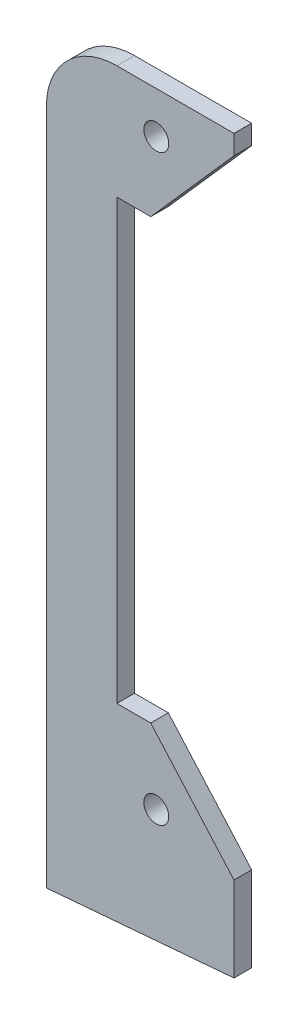
ISO-10303-21;
HEADER;
FILE_DESCRIPTION(('STEP AP214'),'2;1');
FILE_NAME('part.step','',(''),(''),'','','');
FILE_SCHEMA(('AUTOMOTIVE_DESIGN { 1 0 10303 214 1 1 1 1 }'));
ENDSEC;
DATA;
#1=APPLICATION_CONTEXT('core data for automotive mechanical design processes');
#2=APPLICATION_PROTOCOL_DEFINITION('international standard','automotive_design',2000,#1);
#3=PRODUCT_CONTEXT('',#1,'mechanical');
#4=PRODUCT('Part','Part','',(#3));
#5=PRODUCT_RELATED_PRODUCT_CATEGORY('part','',(#4));
#6=PRODUCT_DEFINITION_FORMATION('','',#4);
#7=PRODUCT_DEFINITION_CONTEXT('part definition',#1,'design');
#8=PRODUCT_DEFINITION('design','',#6,#7);
#9=PRODUCT_DEFINITION_SHAPE('','',#8);
#10=(LENGTH_UNIT() NAMED_UNIT(*) SI_UNIT(.MILLI.,.METRE.));
#11=(NAMED_UNIT(*) PLANE_ANGLE_UNIT() SI_UNIT($,.RADIAN.));
#12=(NAMED_UNIT(*) SI_UNIT($,.STERADIAN.) SOLID_ANGLE_UNIT());
#13=UNCERTAINTY_MEASURE_WITH_UNIT(LENGTH_MEASURE(1.E-05),#10,'distance_accuracy_value','');
#14=(GEOMETRIC_REPRESENTATION_CONTEXT(3) GLOBAL_UNCERTAINTY_ASSIGNED_CONTEXT((#13)) GLOBAL_UNIT_ASSIGNED_CONTEXT((#10,
#11,#12)) REPRESENTATION_CONTEXT('',''));
#15=CARTESIAN_POINT('',(0.,0.,0.));
#16=DIRECTION('',(0.,0.,1.));
#17=DIRECTION('',(1.,0.,0.));
#18=AXIS2_PLACEMENT_3D('',#15,#16,#17);
#19=CARTESIAN_POINT('',(-223.5,3.5,3.175));
#20=DIRECTION('',(-1.,0.,0.));
#21=DIRECTION('',(0.,0.,1.));
#22=AXIS2_PLACEMENT_3D('',#19,#20,#21);
#23=PLANE('',#22);
#24=DIRECTION('',(0.,1.,0.));
#25=VECTOR('',#24,1.);
#26=CARTESIAN_POINT('',(-223.5,3.5,3.175));
#27=LINE('',#26,#25);
#28=CARTESIAN_POINT('',(-223.5,-11.7915,3.175));
#29=VERTEX_POINT('',#28);
#30=CARTESIAN_POINT('',(-223.5,3.5,3.175));
#31=VERTEX_POINT('',#30);
#32=EDGE_CURVE('E129',#29,#31,#27,.T.);
#33=ORIENTED_EDGE('',*,*,#32,.F.);
#34=DIRECTION('',(0.,0.,1.));
#35=VECTOR('',#34,1.);
#36=CARTESIAN_POINT('',(-223.5,-11.7915,-1.905));
#37=LINE('',#36,#35);
#38=CARTESIAN_POINT('',(-223.5,-11.7915,0.));
#39=VERTEX_POINT('',#38);
#40=EDGE_CURVE('E118',#39,#29,#37,.T.);
#41=ORIENTED_EDGE('',*,*,#40,.F.);
#42=DIRECTION('',(0.,1.,0.));
#43=VECTOR('',#42,1.);
#44=CARTESIAN_POINT('',(-223.5,3.5,0.));
#45=LINE('',#44,#43);
#46=CARTESIAN_POINT('',(-223.5,3.5,0.));
#47=VERTEX_POINT('',#46);
#48=EDGE_CURVE('E162',#39,#47,#45,.T.);
#49=ORIENTED_EDGE('',*,*,#48,.T.);
#50=DIRECTION('',(0.,0.,-1.));
#51=VECTOR('',#50,1.);
#52=CARTESIAN_POINT('',(-223.5,3.5,3.175));
#53=LINE('',#52,#51);
#54=EDGE_CURVE('E135',#31,#47,#53,.T.);
#55=ORIENTED_EDGE('',*,*,#54,.F.);
#56=EDGE_LOOP('',(#33,#41,#49,#55));
#57=FACE_BOUND('',#56,.T.);
#58=ADVANCED_FACE('F36',(#57),#23,.F.);
#59=CARTESIAN_POINT('',(-223.5,3.5,3.175));
#60=DIRECTION('',(-0.749837855365093,-0.661621637086846,0.));
#61=DIRECTION('',(0.661621637086846,-0.749837855365093,0.));
#62=AXIS2_PLACEMENT_3D('',#59,#60,#61);
#63=PLANE('',#62);
#64=DIRECTION('',(-0.661621637086846,0.749837855365093,0.));
#65=VECTOR('',#64,1.);
#66=CARTESIAN_POINT('',(-223.5,3.5,0.));
#67=LINE('',#66,#65);
#68=CARTESIAN_POINT('',(-238.5,20.5,0.));
#69=VERTEX_POINT('',#68);
#70=EDGE_CURVE('E164',#47,#69,#67,.T.);
#71=ORIENTED_EDGE('',*,*,#70,.T.);
#72=DIRECTION('',(0.,0.,-1.));
#73=VECTOR('',#72,1.);
#74=CARTESIAN_POINT('',(-238.5,20.5,3.175));
#75=LINE('',#74,#73);
#76=CARTESIAN_POINT('',(-238.5,20.5,3.175));
#77=VERTEX_POINT('',#76);
#78=EDGE_CURVE('E192',#77,#69,#75,.T.);
#79=ORIENTED_EDGE('',*,*,#78,.F.);
#80=DIRECTION('',(-0.661621637086846,0.749837855365093,0.));
#81=VECTOR('',#80,1.);
#82=CARTESIAN_POINT('',(-223.5,3.5,3.175));
#83=LINE('',#82,#81);
#84=EDGE_CURVE('E137',#31,#77,#83,.T.);
#85=ORIENTED_EDGE('',*,*,#84,.F.);
#86=ORIENTED_EDGE('',*,*,#54,.T.);
#87=EDGE_LOOP('',(#71,#79,#85,#86));
#88=FACE_BOUND('',#87,.T.);
#89=ADVANCED_FACE('F239',(#88),#63,.F.);
#90=CARTESIAN_POINT('',(-238.5,20.5,3.175));
#91=DIRECTION('',(0.,-1.,0.));
#92=DIRECTION('',(0.,0.,-1.));
#93=AXIS2_PLACEMENT_3D('',#90,#91,#92);
#94=PLANE('',#93);
#95=DIRECTION('',(-1.,0.,0.));
#96=VECTOR('',#95,1.);
#97=CARTESIAN_POINT('',(-238.5,20.5,0.));
#98=LINE('',#97,#96);
#99=CARTESIAN_POINT('',(-244.6,20.5,0.));
#100=VERTEX_POINT('',#99);
#101=EDGE_CURVE('E166',#69,#100,#98,.T.);
#102=ORIENTED_EDGE('',*,*,#101,.T.);
#103=DIRECTION('',(0.,0.,-1.));
#104=VECTOR('',#103,1.);
#105=CARTESIAN_POINT('',(-244.6,20.5,3.175));
#106=LINE('',#105,#104);
#107=CARTESIAN_POINT('',(-244.6,20.5,3.175));
#108=VERTEX_POINT('',#107);
#109=EDGE_CURVE('E189',#108,#100,#106,.T.);
#110=ORIENTED_EDGE('',*,*,#109,.F.);
#111=DIRECTION('',(-1.,0.,0.));
#112=VECTOR('',#111,1.);
#113=CARTESIAN_POINT('',(-238.5,20.5,3.175));
#114=LINE('',#113,#112);
#115=EDGE_CURVE('E140',#77,#108,#114,.T.);
#116=ORIENTED_EDGE('',*,*,#115,.F.);
#117=ORIENTED_EDGE('',*,*,#78,.T.);
#118=EDGE_LOOP('',(#102,#110,#116,#117));
#119=FACE_BOUND('',#118,.T.);
#120=ADVANCED_FACE('F236',(#119),#94,.F.);
#121=CARTESIAN_POINT('',(-244.6,20.5,3.175));
#122=DIRECTION('',(-1.,0.,0.));
#123=DIRECTION('',(0.,0.,1.));
#124=AXIS2_PLACEMENT_3D('',#121,#122,#123);
#125=PLANE('',#124);
#126=DIRECTION('',(0.,1.,0.));
#127=VECTOR('',#126,1.);
#128=CARTESIAN_POINT('',(-244.6,20.5,0.));
#129=LINE('',#128,#127);
#130=CARTESIAN_POINT('',(-244.6,99.5,0.));
#131=VERTEX_POINT('',#130);
#132=EDGE_CURVE('E168',#100,#131,#129,.T.);
#133=ORIENTED_EDGE('',*,*,#132,.T.);
#134=DIRECTION('',(0.,0.,-1.));
#135=VECTOR('',#134,1.);
#136=CARTESIAN_POINT('',(-244.6,99.5,3.175));
#137=LINE('',#136,#135);
#138=CARTESIAN_POINT('',(-244.6,99.5,3.175));
#139=VERTEX_POINT('',#138);
#140=EDGE_CURVE('E186',#139,#131,#137,.T.);
#141=ORIENTED_EDGE('',*,*,#140,.F.);
#142=DIRECTION('',(0.,1.,0.));
#143=VECTOR('',#142,1.);
#144=CARTESIAN_POINT('',(-244.6,20.5,3.175));
#145=LINE('',#144,#143);
#146=EDGE_CURVE('E150',#108,#139,#145,.T.);
#147=ORIENTED_EDGE('',*,*,#146,.F.);
#148=ORIENTED_EDGE('',*,*,#109,.T.);
#149=EDGE_LOOP('',(#133,#141,#147,#148));
#150=FACE_BOUND('',#149,.T.);
#151=ADVANCED_FACE('F231',(#150),#125,.F.);
#152=CARTESIAN_POINT('',(-244.6,99.5,3.175));
#153=DIRECTION('',(0.,1.,0.));
#154=DIRECTION('',(0.,0.,1.));
#155=AXIS2_PLACEMENT_3D('',#152,#153,#154);
#156=PLANE('',#155);
#157=DIRECTION('',(1.,0.,0.));
#158=VECTOR('',#157,1.);
#159=CARTESIAN_POINT('',(-244.6,99.5,0.));
#160=LINE('',#159,#158);
#161=CARTESIAN_POINT('',(-238.5,99.5,0.));
#162=VERTEX_POINT('',#161);
#163=EDGE_CURVE('E170',#131,#162,#160,.T.);
#164=ORIENTED_EDGE('',*,*,#163,.T.);
#165=DIRECTION('',(0.,0.,-1.));
#166=VECTOR('',#165,1.);
#167=CARTESIAN_POINT('',(-238.5,99.5,3.175));
#168=LINE('',#167,#166);
#169=CARTESIAN_POINT('',(-238.5,99.5,3.175));
#170=VERTEX_POINT('',#169);
#171=EDGE_CURVE('E183',#170,#162,#168,.T.);
#172=ORIENTED_EDGE('',*,*,#171,.F.);
#173=DIRECTION('',(1.,0.,0.));
#174=VECTOR('',#173,1.);
#175=CARTESIAN_POINT('',(-244.6,99.5,3.175));
#176=LINE('',#175,#174);
#177=EDGE_CURVE('E152',#139,#170,#176,.T.);
#178=ORIENTED_EDGE('',*,*,#177,.F.);
#179=ORIENTED_EDGE('',*,*,#140,.T.);
#180=EDGE_LOOP('',(#164,#172,#178,#179));
#181=FACE_BOUND('',#180,.T.);
#182=ADVANCED_FACE('F225',(#181),#156,.F.);
#183=CARTESIAN_POINT('',(-238.5,99.5,3.175));
#184=DIRECTION('',(-0.749837855365093,0.661621637086846,0.));
#185=DIRECTION('',(-0.661621637086846,-0.749837855365093,0.));
#186=AXIS2_PLACEMENT_3D('',#183,#184,#185);
#187=PLANE('',#186);
#188=DIRECTION('',(0.661621637086846,0.749837855365093,0.));
#189=VECTOR('',#188,1.);
#190=CARTESIAN_POINT('',(-238.5,99.5,0.));
#191=LINE('',#190,#189);
#192=CARTESIAN_POINT('',(-223.5,116.5,0.));
#193=VERTEX_POINT('',#192);
#194=EDGE_CURVE('E172',#162,#193,#191,.T.);
#195=ORIENTED_EDGE('',*,*,#194,.T.);
#196=DIRECTION('',(0.,0.,-1.));
#197=VECTOR('',#196,1.);
#198=CARTESIAN_POINT('',(-223.5,116.5,3.175));
#199=LINE('',#198,#197);
#200=CARTESIAN_POINT('',(-223.5,116.5,3.175));
#201=VERTEX_POINT('',#200);
#202=EDGE_CURVE('E180',#201,#193,#199,.T.);
#203=ORIENTED_EDGE('',*,*,#202,.F.);
#204=DIRECTION('',(0.661621637086846,0.749837855365093,0.));
#205=VECTOR('',#204,1.);
#206=CARTESIAN_POINT('',(-238.5,99.5,3.175));
#207=LINE('',#206,#205);
#208=EDGE_CURVE('E154',#170,#201,#207,.T.);
#209=ORIENTED_EDGE('',*,*,#208,.F.);
#210=ORIENTED_EDGE('',*,*,#171,.T.);
#211=EDGE_LOOP('',(#195,#203,#209,#210));
#212=FACE_BOUND('',#211,.T.);
#213=ADVANCED_FACE('F220',(#212),#187,.F.);
#214=CARTESIAN_POINT('',(-223.5,118.,3.175));
#215=DIRECTION('',(-1.,0.,0.));
#216=DIRECTION('',(0.,0.,1.));
#217=AXIS2_PLACEMENT_3D('',#214,#215,#216);
#218=PLANE('',#217);
#219=DIRECTION('',(0.,1.,0.));
#220=VECTOR('',#219,1.);
#221=CARTESIAN_POINT('',(-223.5,118.,0.));
#222=LINE('',#221,#220);
#223=CARTESIAN_POINT('',(-223.5,120.,0.));
#224=VERTEX_POINT('',#223);
#225=EDGE_CURVE('E175',#193,#224,#222,.T.);
#226=ORIENTED_EDGE('',*,*,#225,.T.);
#227=DIRECTION('',(0.,0.,-1.));
#228=VECTOR('',#227,1.);
#229=CARTESIAN_POINT('',(-223.5,120.,3.175));
#230=LINE('',#229,#228);
#231=CARTESIAN_POINT('',(-223.5,120.,3.175));
#232=VERTEX_POINT('',#231);
#233=EDGE_CURVE('E161',#232,#224,#230,.T.);
#234=ORIENTED_EDGE('',*,*,#233,.F.);
#235=DIRECTION('',(0.,1.,0.));
#236=VECTOR('',#235,1.);
#237=CARTESIAN_POINT('',(-223.5,116.5,3.175));
#238=LINE('',#237,#236);
#239=EDGE_CURVE('E156',#201,#232,#238,.T.);
#240=ORIENTED_EDGE('',*,*,#239,.F.);
#241=ORIENTED_EDGE('',*,*,#202,.T.);
#242=EDGE_LOOP('',(#226,#234,#240,#241));
#243=FACE_BOUND('',#242,.T.);
#244=ADVANCED_FACE('F215',(#243),#218,.F.);
#245=CARTESIAN_POINT('',(-223.5,120.,3.175));
#246=DIRECTION('',(0.,-1.,0.));
#247=DIRECTION('',(0.,0.,-1.));
#248=AXIS2_PLACEMENT_3D('',#245,#246,#247);
#249=PLANE('',#248);
#250=DIRECTION('',(-1.,0.,0.));
#251=VECTOR('',#250,1.);
#252=CARTESIAN_POINT('',(-223.5,120.,0.));
#253=LINE('',#252,#251);
#254=CARTESIAN_POINT('',(-244.599999878,120.,0.));
#255=VERTEX_POINT('',#254);
#256=EDGE_CURVE('E143',#224,#255,#253,.T.);
#257=ORIENTED_EDGE('',*,*,#256,.T.);
#258=DIRECTION('',(0.,0.,-1.));
#259=VECTOR('',#258,1.);
#260=CARTESIAN_POINT('',(-244.599999878,120.,3.175));
#261=LINE('',#260,#259);
#262=CARTESIAN_POINT('',(-244.599999878,120.,3.175));
#263=VERTEX_POINT('',#262);
#264=EDGE_CURVE('E58',#255,#263,#261,.F.);
#265=ORIENTED_EDGE('',*,*,#264,.T.);
#266=DIRECTION('',(-1.,0.,0.));
#267=VECTOR('',#266,1.);
#268=CARTESIAN_POINT('',(-223.5,120.,3.175));
#269=LINE('',#268,#267);
#270=EDGE_CURVE('E158',#232,#263,#269,.T.);
#271=ORIENTED_EDGE('',*,*,#270,.F.);
#272=ORIENTED_EDGE('',*,*,#233,.T.);
#273=EDGE_LOOP('',(#257,#265,#271,#272));
#274=FACE_BOUND('',#273,.T.);
#275=ADVANCED_FACE('F211',(#274),#249,.F.);
#276=CARTESIAN_POINT('',(-257.299999878,118.,3.175));
#277=DIRECTION('',(1.,0.,0.));
#278=DIRECTION('',(0.,0.,-1.));
#279=AXIS2_PLACEMENT_3D('',#276,#277,#278);
#280=PLANE('',#279);
#281=DIRECTION('',(0.,-1.,0.));
#282=VECTOR('',#281,1.);
#283=CARTESIAN_POINT('',(-257.299999878,118.,0.));
#284=LINE('',#283,#282);
#285=CARTESIAN_POINT('',(-257.299999878,107.3,0.));
#286=VERTEX_POINT('',#285);
#287=CARTESIAN_POINT('',(-257.299999878,-14.6449161528608,0.));
#288=VERTEX_POINT('',#287);
#289=EDGE_CURVE('E138',#286,#288,#284,.T.);
#290=ORIENTED_EDGE('',*,*,#289,.T.);
#291=DIRECTION('',(0.,0.,1.));
#292=VECTOR('',#291,1.);
#293=CARTESIAN_POINT('',(-257.299999878,-14.6449161528608,-1.905));
#294=LINE('',#293,#292);
#295=CARTESIAN_POINT('',(-257.299999878,-14.6449161528608,3.175));
#296=VERTEX_POINT('',#295);
#297=EDGE_CURVE('E50',#288,#296,#294,.T.);
#298=ORIENTED_EDGE('',*,*,#297,.T.);
#299=DIRECTION('',(0.,-1.,0.));
#300=VECTOR('',#299,1.);
#301=CARTESIAN_POINT('',(-257.299999878,120.,3.175));
#302=LINE('',#301,#300);
#303=CARTESIAN_POINT('',(-257.299999878,107.3,3.175));
#304=VERTEX_POINT('',#303);
#305=EDGE_CURVE('E132',#304,#296,#302,.T.);
#306=ORIENTED_EDGE('',*,*,#305,.F.);
#307=DIRECTION('',(0.,0.,-1.));
#308=VECTOR('',#307,1.);
#309=CARTESIAN_POINT('',(-257.299999878,107.3,3.175));
#310=LINE('',#309,#308);
#311=EDGE_CURVE('E196',#304,#286,#310,.T.);
#312=ORIENTED_EDGE('',*,*,#311,.T.);
#313=EDGE_LOOP('',(#290,#298,#306,#312));
#314=FACE_BOUND('',#313,.T.);
#315=ADVANCED_FACE('F205',(#314),#280,.F.);
#316=CARTESIAN_POINT('',(0.,0.,3.175));
#317=DIRECTION('',(0.,0.,-1.));
#318=DIRECTION('',(-1.,0.,0.));
#319=AXIS2_PLACEMENT_3D('',#316,#317,#318);
#320=PLANE('',#319);
#321=CARTESIAN_POINT('',(-237.5,7.5,3.175));
#322=DIRECTION('',(0.,0.,-1.));
#323=DIRECTION('',(-1.,0.,0.));
#324=AXIS2_PLACEMENT_3D('',#321,#322,#323);
#325=CIRCLE('',#324,2.25000000000001);
#326=CARTESIAN_POINT('',(-239.75,7.5,3.175));
#327=VERTEX_POINT('',#326);
#328=EDGE_CURVE('E146',#327,#327,#325,.F.);
#329=ORIENTED_EDGE('',*,*,#328,.F.);
#330=EDGE_LOOP('',(#329));
#331=FACE_BOUND('',#330,.T.);
#332=CARTESIAN_POINT('',(-237.5,112.5,3.175));
#333=DIRECTION('',(0.,0.,-1.));
#334=DIRECTION('',(-1.,0.,0.));
#335=AXIS2_PLACEMENT_3D('',#332,#333,#334);
#336=CIRCLE('',#335,2.25000000000001);
#337=CARTESIAN_POINT('',(-239.75,112.5,3.175));
#338=VERTEX_POINT('',#337);
#339=EDGE_CURVE('E387',#338,#338,#336,.F.);
#340=ORIENTED_EDGE('',*,*,#339,.F.);
#341=EDGE_LOOP('',(#340));
#342=FACE_BOUND('',#341,.T.);
#343=ORIENTED_EDGE('',*,*,#305,.T.);
#344=DIRECTION('',(-0.996455515948027,-0.0841213690850928,0.));
#345=VECTOR('',#344,1.);
#346=CARTESIAN_POINT('',(-223.5,-11.7915,3.175));
#347=LINE('',#346,#345);
#348=EDGE_CURVE('E121',#29,#296,#347,.T.);
#349=ORIENTED_EDGE('',*,*,#348,.F.);
#350=ORIENTED_EDGE('',*,*,#32,.T.);
#351=ORIENTED_EDGE('',*,*,#84,.T.);
#352=ORIENTED_EDGE('',*,*,#115,.T.);
#353=ORIENTED_EDGE('',*,*,#146,.T.);
#354=ORIENTED_EDGE('',*,*,#177,.T.);
#355=ORIENTED_EDGE('',*,*,#208,.T.);
#356=ORIENTED_EDGE('',*,*,#239,.T.);
#357=ORIENTED_EDGE('',*,*,#270,.T.);
#358=CARTESIAN_POINT('',(-244.599999878,107.3,3.175));
#359=DIRECTION('',(0.,0.,-1.));
#360=DIRECTION('',(-1.,0.,0.));
#361=AXIS2_PLACEMENT_3D('',#358,#359,#360);
#362=CIRCLE('',#361,12.7);
#363=EDGE_CURVE('E44',#263,#304,#362,.F.);
#364=ORIENTED_EDGE('',*,*,#363,.T.);
#365=EDGE_LOOP('',(#343,#349,#350,#351,#352,#353,#354,#355,#356,#357,#364));
#366=FACE_BOUND('',#365,.T.);
#367=ADVANCED_FACE('F128',(#331,#342,#366),#320,.F.);
#368=CARTESIAN_POINT('',(0.,0.,0.));
#369=DIRECTION('',(0.,0.,-1.));
#370=DIRECTION('',(-1.,0.,0.));
#371=AXIS2_PLACEMENT_3D('',#368,#369,#370);
#372=PLANE('',#371);
#373=DIRECTION('',(0.996455515948028,0.0841213690850928,0.));
#374=VECTOR('',#373,1.);
#375=CARTESIAN_POINT('',(-0.593175169522206,7.02642712573912,0.));
#376=LINE('',#375,#374);
#377=EDGE_CURVE('E11',#288,#39,#376,.T.);
#378=ORIENTED_EDGE('',*,*,#377,.F.);
#379=ORIENTED_EDGE('',*,*,#289,.F.);
#380=CARTESIAN_POINT('',(-244.599999878,107.3,0.));
#381=DIRECTION('',(0.,0.,-1.));
#382=DIRECTION('',(-1.,0.,0.));
#383=AXIS2_PLACEMENT_3D('',#380,#381,#382);
#384=CIRCLE('',#383,12.7);
#385=EDGE_CURVE('E199',#286,#255,#384,.T.);
#386=ORIENTED_EDGE('',*,*,#385,.T.);
#387=ORIENTED_EDGE('',*,*,#256,.F.);
#388=ORIENTED_EDGE('',*,*,#225,.F.);
#389=ORIENTED_EDGE('',*,*,#194,.F.);
#390=ORIENTED_EDGE('',*,*,#163,.F.);
#391=ORIENTED_EDGE('',*,*,#132,.F.);
#392=ORIENTED_EDGE('',*,*,#101,.F.);
#393=ORIENTED_EDGE('',*,*,#70,.F.);
#394=ORIENTED_EDGE('',*,*,#48,.F.);
#395=EDGE_LOOP('',(#378,#379,#386,#387,#388,#389,#390,#391,#392,#393,#394));
#396=FACE_BOUND('',#395,.T.);
#397=CARTESIAN_POINT('',(-237.5,7.5,0.));
#398=DIRECTION('',(0.,0.,1.));
#399=DIRECTION('',(1.,0.,0.));
#400=AXIS2_PLACEMENT_3D('',#397,#398,#399);
#401=CIRCLE('',#400,2.25000000000001);
#402=CARTESIAN_POINT('',(-239.75,7.5,0.));
#403=VERTEX_POINT('',#402);
#404=EDGE_CURVE('E384',#403,#403,#401,.T.);
#405=ORIENTED_EDGE('',*,*,#404,.T.);
#406=EDGE_LOOP('',(#405));
#407=FACE_BOUND('',#406,.T.);
#408=CARTESIAN_POINT('',(-237.5,112.5,0.));
#409=DIRECTION('',(0.,0.,1.));
#410=DIRECTION('',(1.,0.,0.));
#411=AXIS2_PLACEMENT_3D('',#408,#409,#410);
#412=CIRCLE('',#411,2.25000000000001);
#413=CARTESIAN_POINT('',(-239.75,112.5,0.));
#414=VERTEX_POINT('',#413);
#415=EDGE_CURVE('E391',#414,#414,#412,.T.);
#416=ORIENTED_EDGE('',*,*,#415,.T.);
#417=EDGE_LOOP('',(#416));
#418=FACE_BOUND('',#417,.T.);
#419=ADVANCED_FACE('F209',(#396,#407,#418),#372,.T.);
#420=CARTESIAN_POINT('',(-237.5,112.5,14.097));
#421=DIRECTION('',(0.,0.,-1.));
#422=DIRECTION('',(-1.,0.,0.));
#423=AXIS2_PLACEMENT_3D('',#420,#421,#422);
#424=CYLINDRICAL_SURFACE('',#423,2.25000000000001);
#425=CARTESIAN_POINT('',(-239.75,112.5,0.));
#426=CARTESIAN_POINT('',(-239.75,112.5,0.0330729166666665));
#427=CARTESIAN_POINT('',(-239.75,112.5,0.066145833333333));
#428=CARTESIAN_POINT('',(-239.75,112.5,0.132291666666667));
#429=CARTESIAN_POINT('',(-239.75,112.5,0.165364583333334));
#430=CARTESIAN_POINT('',(-239.75,112.5,0.231510416666667));
#431=CARTESIAN_POINT('',(-239.75,112.5,0.264583333333334));
#432=CARTESIAN_POINT('',(-239.75,112.5,0.330729166666667));
#433=CARTESIAN_POINT('',(-239.75,112.5,0.363802083333333));
#434=CARTESIAN_POINT('',(-239.75,112.5,0.429947916666667));
#435=CARTESIAN_POINT('',(-239.75,112.5,0.463020833333334));
#436=CARTESIAN_POINT('',(-239.75,112.5,0.529166666666667));
#437=CARTESIAN_POINT('',(-239.75,112.5,0.562239583333334));
#438=CARTESIAN_POINT('',(-239.75,112.5,0.628385416666667));
#439=CARTESIAN_POINT('',(-239.75,112.5,0.661458333333333));
#440=CARTESIAN_POINT('',(-239.75,112.5,0.727604166666666));
#441=CARTESIAN_POINT('',(-239.75,112.5,0.760677083333333));
#442=CARTESIAN_POINT('',(-239.75,112.5,0.826822916666666));
#443=CARTESIAN_POINT('',(-239.75,112.5,0.859895833333334));
#444=CARTESIAN_POINT('',(-239.75,112.5,0.926041666666667));
#445=CARTESIAN_POINT('',(-239.75,112.5,0.959114583333334));
#446=CARTESIAN_POINT('',(-239.75,112.5,1.02526041666667));
#447=CARTESIAN_POINT('',(-239.75,112.5,1.05833333333333));
#448=CARTESIAN_POINT('',(-239.75,112.5,1.12447916666667));
#449=CARTESIAN_POINT('',(-239.75,112.5,1.15755208333333));
#450=CARTESIAN_POINT('',(-239.75,112.5,1.22369791666667));
#451=CARTESIAN_POINT('',(-239.75,112.5,1.25677083333333));
#452=CARTESIAN_POINT('',(-239.75,112.5,1.32291666666667));
#453=CARTESIAN_POINT('',(-239.75,112.5,1.35598958333333));
#454=CARTESIAN_POINT('',(-239.75,112.5,1.42213541666667));
#455=CARTESIAN_POINT('',(-239.75,112.5,1.45520833333333));
#456=CARTESIAN_POINT('',(-239.75,112.5,1.52135416666667));
#457=CARTESIAN_POINT('',(-239.75,112.5,1.55442708333333));
#458=CARTESIAN_POINT('',(-239.75,112.5,1.62057291666667));
#459=CARTESIAN_POINT('',(-239.75,112.5,1.65364583333333));
#460=CARTESIAN_POINT('',(-239.75,112.5,1.71979166666667));
#461=CARTESIAN_POINT('',(-239.75,112.5,1.75286458333333));
#462=CARTESIAN_POINT('',(-239.75,112.5,1.81901041666667));
#463=CARTESIAN_POINT('',(-239.75,112.5,1.85208333333333));
#464=CARTESIAN_POINT('',(-239.75,112.5,1.91822916666667));
#465=CARTESIAN_POINT('',(-239.75,112.5,1.95130208333333));
#466=CARTESIAN_POINT('',(-239.75,112.5,2.01744791666667));
#467=CARTESIAN_POINT('',(-239.75,112.5,2.05052083333333));
#468=CARTESIAN_POINT('',(-239.75,112.5,2.11666666666667));
#469=CARTESIAN_POINT('',(-239.75,112.5,2.14973958333333));
#470=CARTESIAN_POINT('',(-239.75,112.5,2.21588541666667));
#471=CARTESIAN_POINT('',(-239.75,112.5,2.24895833333333));
#472=CARTESIAN_POINT('',(-239.75,112.5,2.31510416666667));
#473=CARTESIAN_POINT('',(-239.75,112.5,2.34817708333333));
#474=CARTESIAN_POINT('',(-239.75,112.5,2.41432291666667));
#475=CARTESIAN_POINT('',(-239.75,112.5,2.44739583333333));
#476=CARTESIAN_POINT('',(-239.75,112.5,2.51354166666667));
#477=CARTESIAN_POINT('',(-239.75,112.5,2.54661458333333));
#478=CARTESIAN_POINT('',(-239.75,112.5,2.61276041666667));
#479=CARTESIAN_POINT('',(-239.75,112.5,2.64583333333333));
#480=CARTESIAN_POINT('',(-239.75,112.5,2.71197916666667));
#481=CARTESIAN_POINT('',(-239.75,112.5,2.74505208333333));
#482=CARTESIAN_POINT('',(-239.75,112.5,2.81119791666667));
#483=CARTESIAN_POINT('',(-239.75,112.5,2.84427083333333));
#484=CARTESIAN_POINT('',(-239.75,112.5,2.91041666666667));
#485=CARTESIAN_POINT('',(-239.75,112.5,2.94348958333333));
#486=CARTESIAN_POINT('',(-239.75,112.5,3.00963541666667));
#487=CARTESIAN_POINT('',(-239.75,112.5,3.04270833333333));
#488=CARTESIAN_POINT('',(-239.75,112.5,3.10885416666667));
#489=CARTESIAN_POINT('',(-239.75,112.5,3.14192708333333));
#490=CARTESIAN_POINT('',(-239.75,112.5,3.175));
#491=B_SPLINE_CURVE_WITH_KNOTS('',3,(#425,#426,#427,#428,#429,#430,#431,#432,#433,#434,#435,
#436,#437,#438,#439,#440,#441,#442,#443,#444,#445,#446,#447,#448,#449,#450,#451,#452,#453,#454,
#455,#456,#457,#458,#459,#460,#461,#462,#463,#464,#465,#466,#467,#468,#469,#470,#471,#472,#473,
#474,#475,#476,#477,#478,#479,#480,#481,#482,#483,#484,#485,#486,#487,#488,#489,#490),
.UNSPECIFIED.,.F.,.F.,(4,2,2,2,2,2,2,2,2,2,2,2,2,2,2,2,2,2,2,2,2,2,2,2,2,2,2,2,2,2,2,2,4),(0.,
0.0992187499999995,0.198437500000001,0.29765625,0.396875,0.496093750000001,0.5953125,0.69453125,
0.793749999999999,0.892968750000001,0.9921875,1.09140625,1.190625,1.28984375,1.3890625,
1.48828125,1.5875,1.68671875,1.7859375,1.88515625,1.984375,2.08359375,2.1828125,2.28203125,
2.38125,2.48046875,2.5796875,2.67890625,2.778125,2.87734375,2.9765625,3.07578125,3.175),.UNSPECIFIED.);
#492=EDGE_CURVE('BSEAM262',#414,#338,#491,.T.);
#493=ORIENTED_EDGE('',*,*,#415,.F.);
#494=ORIENTED_EDGE('',*,*,#339,.T.);
#495=ORIENTED_EDGE('',*,*,#492,.T.);
#496=ORIENTED_EDGE('',*,*,#492,.F.);
#497=EDGE_LOOP('',(#493,#495,#494,#496));
#498=FACE_BOUND('',#497,.T.);
#499=ADVANCED_FACE('F262',(#498),#424,.F.);
#500=CARTESIAN_POINT('',(-237.5,7.5,14.097));
#501=DIRECTION('',(0.,0.,-1.));
#502=DIRECTION('',(-1.,0.,0.));
#503=AXIS2_PLACEMENT_3D('',#500,#501,#502);
#504=CYLINDRICAL_SURFACE('',#503,2.25000000000001);
#505=CARTESIAN_POINT('',(-239.75,7.5,0.));
#506=CARTESIAN_POINT('',(-239.75,7.5,0.0330729166666665));
#507=CARTESIAN_POINT('',(-239.75,7.5,0.066145833333333));
#508=CARTESIAN_POINT('',(-239.75,7.5,0.132291666666667));
#509=CARTESIAN_POINT('',(-239.75,7.5,0.165364583333334));
#510=CARTESIAN_POINT('',(-239.75,7.5,0.231510416666667));
#511=CARTESIAN_POINT('',(-239.75,7.5,0.264583333333334));
#512=CARTESIAN_POINT('',(-239.75,7.5,0.330729166666667));
#513=CARTESIAN_POINT('',(-239.75,7.5,0.363802083333333));
#514=CARTESIAN_POINT('',(-239.75,7.5,0.429947916666667));
#515=CARTESIAN_POINT('',(-239.75,7.5,0.463020833333334));
#516=CARTESIAN_POINT('',(-239.75,7.5,0.529166666666667));
#517=CARTESIAN_POINT('',(-239.75,7.5,0.562239583333334));
#518=CARTESIAN_POINT('',(-239.75,7.5,0.628385416666667));
#519=CARTESIAN_POINT('',(-239.75,7.5,0.661458333333333));
#520=CARTESIAN_POINT('',(-239.75,7.5,0.727604166666666));
#521=CARTESIAN_POINT('',(-239.75,7.5,0.760677083333333));
#522=CARTESIAN_POINT('',(-239.75,7.5,0.826822916666666));
#523=CARTESIAN_POINT('',(-239.75,7.5,0.859895833333334));
#524=CARTESIAN_POINT('',(-239.75,7.5,0.926041666666667));
#525=CARTESIAN_POINT('',(-239.75,7.5,0.959114583333334));
#526=CARTESIAN_POINT('',(-239.75,7.5,1.02526041666667));
#527=CARTESIAN_POINT('',(-239.75,7.5,1.05833333333333));
#528=CARTESIAN_POINT('',(-239.75,7.5,1.12447916666667));
#529=CARTESIAN_POINT('',(-239.75,7.5,1.15755208333333));
#530=CARTESIAN_POINT('',(-239.75,7.5,1.22369791666667));
#531=CARTESIAN_POINT('',(-239.75,7.5,1.25677083333333));
#532=CARTESIAN_POINT('',(-239.75,7.5,1.32291666666667));
#533=CARTESIAN_POINT('',(-239.75,7.5,1.35598958333333));
#534=CARTESIAN_POINT('',(-239.75,7.5,1.42213541666667));
#535=CARTESIAN_POINT('',(-239.75,7.5,1.45520833333333));
#536=CARTESIAN_POINT('',(-239.75,7.5,1.52135416666667));
#537=CARTESIAN_POINT('',(-239.75,7.5,1.55442708333333));
#538=CARTESIAN_POINT('',(-239.75,7.5,1.62057291666667));
#539=CARTESIAN_POINT('',(-239.75,7.5,1.65364583333333));
#540=CARTESIAN_POINT('',(-239.75,7.5,1.71979166666667));
#541=CARTESIAN_POINT('',(-239.75,7.5,1.75286458333333));
#542=CARTESIAN_POINT('',(-239.75,7.5,1.81901041666667));
#543=CARTESIAN_POINT('',(-239.75,7.5,1.85208333333333));
#544=CARTESIAN_POINT('',(-239.75,7.5,1.91822916666667));
#545=CARTESIAN_POINT('',(-239.75,7.5,1.95130208333333));
#546=CARTESIAN_POINT('',(-239.75,7.5,2.01744791666667));
#547=CARTESIAN_POINT('',(-239.75,7.5,2.05052083333333));
#548=CARTESIAN_POINT('',(-239.75,7.5,2.11666666666667));
#549=CARTESIAN_POINT('',(-239.75,7.5,2.14973958333333));
#550=CARTESIAN_POINT('',(-239.75,7.5,2.21588541666667));
#551=CARTESIAN_POINT('',(-239.75,7.5,2.24895833333333));
#552=CARTESIAN_POINT('',(-239.75,7.5,2.31510416666667));
#553=CARTESIAN_POINT('',(-239.75,7.5,2.34817708333333));
#554=CARTESIAN_POINT('',(-239.75,7.5,2.41432291666667));
#555=CARTESIAN_POINT('',(-239.75,7.5,2.44739583333333));
#556=CARTESIAN_POINT('',(-239.75,7.5,2.51354166666667));
#557=CARTESIAN_POINT('',(-239.75,7.5,2.54661458333333));
#558=CARTESIAN_POINT('',(-239.75,7.5,2.61276041666667));
#559=CARTESIAN_POINT('',(-239.75,7.5,2.64583333333333));
#560=CARTESIAN_POINT('',(-239.75,7.5,2.71197916666667));
#561=CARTESIAN_POINT('',(-239.75,7.5,2.74505208333333));
#562=CARTESIAN_POINT('',(-239.75,7.5,2.81119791666667));
#563=CARTESIAN_POINT('',(-239.75,7.5,2.84427083333333));
#564=CARTESIAN_POINT('',(-239.75,7.5,2.91041666666667));
#565=CARTESIAN_POINT('',(-239.75,7.5,2.94348958333333));
#566=CARTESIAN_POINT('',(-239.75,7.5,3.00963541666667));
#567=CARTESIAN_POINT('',(-239.75,7.5,3.04270833333333));
#568=CARTESIAN_POINT('',(-239.75,7.5,3.10885416666667));
#569=CARTESIAN_POINT('',(-239.75,7.5,3.14192708333333));
#570=CARTESIAN_POINT('',(-239.75,7.5,3.175));
#571=B_SPLINE_CURVE_WITH_KNOTS('',3,(#505,#506,#507,#508,#509,#510,#511,#512,#513,#514,#515,
#516,#517,#518,#519,#520,#521,#522,#523,#524,#525,#526,#527,#528,#529,#530,#531,#532,#533,#534,
#535,#536,#537,#538,#539,#540,#541,#542,#543,#544,#545,#546,#547,#548,#549,#550,#551,#552,#553,
#554,#555,#556,#557,#558,#559,#560,#561,#562,#563,#564,#565,#566,#567,#568,#569,#570),
.UNSPECIFIED.,.F.,.F.,(4,2,2,2,2,2,2,2,2,2,2,2,2,2,2,2,2,2,2,2,2,2,2,2,2,2,2,2,2,2,2,2,4),(0.,
0.0992187499999995,0.198437500000001,0.29765625,0.396875,0.496093750000001,0.5953125,0.69453125,
0.793749999999999,0.892968750000001,0.9921875,1.09140625,1.190625,1.28984375,1.3890625,
1.48828125,1.5875,1.68671875,1.7859375,1.88515625,1.984375,2.08359375,2.1828125,2.28203125,
2.38125,2.48046875,2.5796875,2.67890625,2.778125,2.87734375,2.9765625,3.07578125,3.175),.UNSPECIFIED.);
#572=EDGE_CURVE('BSEAM268',#403,#327,#571,.T.);
#573=ORIENTED_EDGE('',*,*,#404,.F.);
#574=ORIENTED_EDGE('',*,*,#328,.T.);
#575=ORIENTED_EDGE('',*,*,#572,.T.);
#576=ORIENTED_EDGE('',*,*,#572,.F.);
#577=EDGE_LOOP('',(#573,#575,#574,#576));
#578=FACE_BOUND('',#577,.T.);
#579=ADVANCED_FACE('F268',(#578),#504,.F.);
#580=CARTESIAN_POINT('',(-244.599999878,107.3,3.175));
#581=DIRECTION('',(0.,0.,-1.));
#582=DIRECTION('',(-1.,0.,0.));
#583=AXIS2_PLACEMENT_3D('',#580,#581,#582);
#584=CYLINDRICAL_SURFACE('',#583,12.7);
#585=ORIENTED_EDGE('',*,*,#363,.F.);
#586=ORIENTED_EDGE('',*,*,#264,.F.);
#587=ORIENTED_EDGE('',*,*,#385,.F.);
#588=ORIENTED_EDGE('',*,*,#311,.F.);
#589=EDGE_LOOP('',(#585,#586,#587,#588));
#590=FACE_BOUND('',#589,.T.);
#591=ADVANCED_FACE('F38',(#590),#584,.T.);
#592=CARTESIAN_POINT('',(-223.5,-11.7915,-1.905));
#593=DIRECTION('',(-0.0841213690850928,0.996455515948028,0.));
#594=DIRECTION('',(-0.996455515948028,-0.0841213690850928,0.));
#595=AXIS2_PLACEMENT_3D('',#592,#593,#594);
#596=PLANE('',#595);
#597=ORIENTED_EDGE('',*,*,#377,.T.);
#598=ORIENTED_EDGE('',*,*,#40,.T.);
#599=ORIENTED_EDGE('',*,*,#348,.T.);
#600=ORIENTED_EDGE('',*,*,#297,.F.);
#601=EDGE_LOOP('',(#597,#598,#599,#600));
#602=FACE_BOUND('',#601,.T.);
#603=ADVANCED_FACE('F120',(#602),#596,.F.);
#604=CLOSED_SHELL('',(#58,#89,#120,#151,#182,#213,#244,#275,#315,#367,#419,#499,#579,#591,#603));
#605=MANIFOLD_SOLID_BREP('B2',#604);
#606=ADVANCED_BREP_SHAPE_REPRESENTATION('',(#18,#605),#14);
#607=SHAPE_DEFINITION_REPRESENTATION(#9,#606);
ENDSEC;
END-ISO-10303-21;
